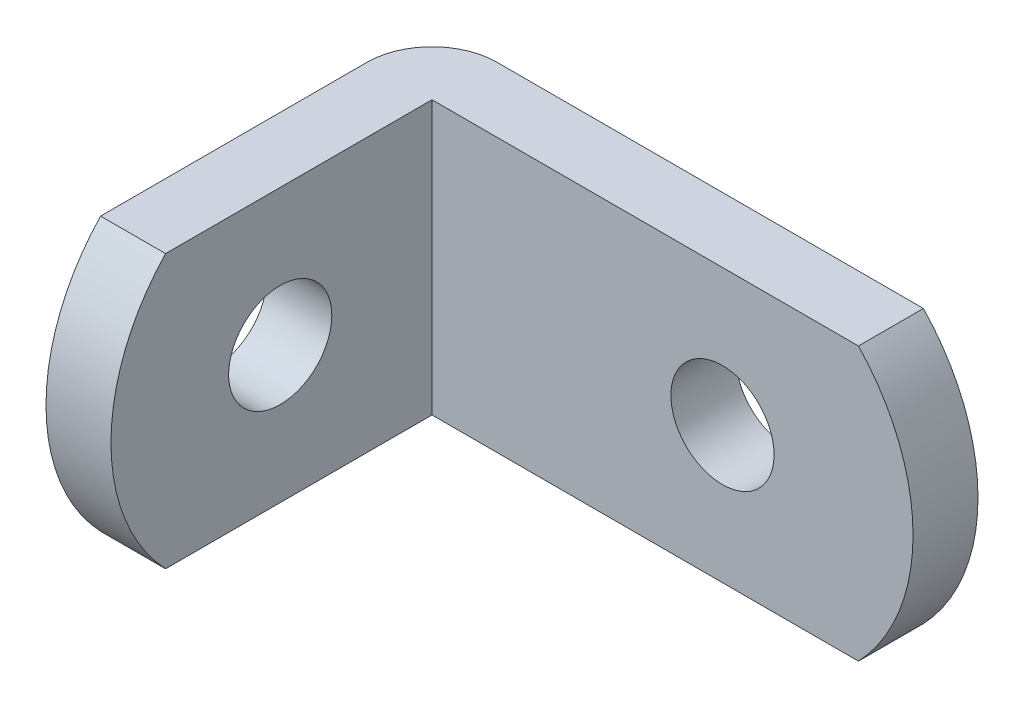
ISO-10303-21;
HEADER;
FILE_DESCRIPTION(('STEP AP214'),'2;1');
FILE_NAME('part.step','',(''),(''),'','','');
FILE_SCHEMA(('AUTOMOTIVE_DESIGN { 1 0 10303 214 1 1 1 1 }'));
ENDSEC;
DATA;
#1=APPLICATION_CONTEXT('core data for automotive mechanical design processes');
#2=APPLICATION_PROTOCOL_DEFINITION('international standard','automotive_design',2000,#1);
#3=PRODUCT_CONTEXT('',#1,'mechanical');
#4=PRODUCT('Part','Part','',(#3));
#5=PRODUCT_RELATED_PRODUCT_CATEGORY('part','',(#4));
#6=PRODUCT_DEFINITION_FORMATION('','',#4);
#7=PRODUCT_DEFINITION_CONTEXT('part definition',#1,'design');
#8=PRODUCT_DEFINITION('design','',#6,#7);
#9=PRODUCT_DEFINITION_SHAPE('','',#8);
#10=(LENGTH_UNIT() NAMED_UNIT(*) SI_UNIT(.MILLI.,.METRE.));
#11=(NAMED_UNIT(*) PLANE_ANGLE_UNIT() SI_UNIT($,.RADIAN.));
#12=(NAMED_UNIT(*) SI_UNIT($,.STERADIAN.) SOLID_ANGLE_UNIT());
#13=UNCERTAINTY_MEASURE_WITH_UNIT(LENGTH_MEASURE(1.E-05),#10,'distance_accuracy_value','');
#14=(GEOMETRIC_REPRESENTATION_CONTEXT(3) GLOBAL_UNCERTAINTY_ASSIGNED_CONTEXT((#13)) GLOBAL_UNIT_ASSIGNED_CONTEXT((#10,
#11,#12)) REPRESENTATION_CONTEXT('',''));
#15=CARTESIAN_POINT('',(0.,0.,0.));
#16=DIRECTION('',(0.,0.,1.));
#17=DIRECTION('',(1.,0.,0.));
#18=AXIS2_PLACEMENT_3D('',#15,#16,#17);
#19=CARTESIAN_POINT('',(72.9938399678853,0.,8.75030000000001));
#20=DIRECTION('',(-1.,0.,0.));
#21=DIRECTION('',(0.,0.,1.));
#22=AXIS2_PLACEMENT_3D('',#19,#20,#21);
#23=CYLINDRICAL_SURFACE('',#22,9.20749999999999);
#24=DIRECTION('',(-1.,0.,0.));
#25=VECTOR('',#24,1.);
#26=CARTESIAN_POINT('',(72.9938399678853,-6.35,15.4178));
#27=LINE('',#26,#25);
#28=CARTESIAN_POINT('',(0.,-6.35,15.4178));
#29=VERTEX_POINT('',#28);
#30=CARTESIAN_POINT('',(3.0226,-6.34999999999999,15.4178));
#31=VERTEX_POINT('',#30);
#32=EDGE_CURVE('E42',#29,#31,#27,.F.);
#33=ORIENTED_EDGE('',*,*,#32,.T.);
#34=CARTESIAN_POINT('',(3.0226,0.,8.75030000000001));
#35=DIRECTION('',(-1.,0.,0.));
#36=DIRECTION('',(0.,0.,1.));
#37=AXIS2_PLACEMENT_3D('',#34,#35,#36);
#38=CIRCLE('',#37,9.20749999999999);
#39=CARTESIAN_POINT('',(3.0226,6.35,15.4178));
#40=VERTEX_POINT('',#39);
#41=EDGE_CURVE('E123',#40,#31,#38,.F.);
#42=ORIENTED_EDGE('',*,*,#41,.F.);
#43=DIRECTION('',(-1.,0.,0.));
#44=VECTOR('',#43,1.);
#45=CARTESIAN_POINT('',(72.9938399678853,6.35,15.4178));
#46=LINE('',#45,#44);
#47=CARTESIAN_POINT('',(0.,6.35,15.4178));
#48=VERTEX_POINT('',#47);
#49=EDGE_CURVE('E119',#40,#48,#46,.T.);
#50=ORIENTED_EDGE('',*,*,#49,.T.);
#51=CARTESIAN_POINT('',(0.,0.,8.75030000000001));
#52=DIRECTION('',(-1.,0.,0.));
#53=DIRECTION('',(0.,0.,1.));
#54=AXIS2_PLACEMENT_3D('',#51,#52,#53);
#55=CIRCLE('',#54,9.20749999999999);
#56=EDGE_CURVE('E125',#48,#29,#55,.F.);
#57=ORIENTED_EDGE('',*,*,#56,.T.);
#58=EDGE_LOOP('',(#33,#42,#50,#57));
#59=FACE_BOUND('',#58,.T.);
#60=ADVANCED_FACE('F34',(#59),#23,.T.);
#61=CARTESIAN_POINT('',(3.0226,6.35,3.0226));
#62=DIRECTION('',(0.,0.,-1.));
#63=DIRECTION('',(-1.,0.,0.));
#64=AXIS2_PLACEMENT_3D('',#61,#62,#63);
#65=PLANE('',#64);
#66=CARTESIAN_POINT('',(16.5354,0.,3.0226));
#67=DIRECTION('',(0.,0.,1.));
#68=DIRECTION('',(1.,0.,0.));
#69=AXIS2_PLACEMENT_3D('',#66,#67,#68);
#70=CIRCLE('',#69,2.4);
#71=CARTESIAN_POINT('',(18.9354,0.,3.0226));
#72=VERTEX_POINT('',#71);
#73=EDGE_CURVE('E167',#72,#72,#70,.T.);
#74=ORIENTED_EDGE('',*,*,#73,.F.);
#75=EDGE_LOOP('',(#74));
#76=FACE_BOUND('',#75,.T.);
#77=DIRECTION('',(1.,0.,0.));
#78=VECTOR('',#77,1.);
#79=CARTESIAN_POINT('',(3.0226,-6.35,3.0226));
#80=LINE('',#79,#78);
#81=CARTESIAN_POINT('',(3.0226,-6.35,3.0226));
#82=VERTEX_POINT('',#81);
#83=CARTESIAN_POINT('',(22.86,-6.35,3.0226));
#84=VERTEX_POINT('',#83);
#85=EDGE_CURVE('E102',#82,#84,#80,.T.);
#86=ORIENTED_EDGE('',*,*,#85,.T.);
#87=CARTESIAN_POINT('',(16.1925,0.,3.0226));
#88=DIRECTION('',(0.,0.,-1.));
#89=DIRECTION('',(-1.,0.,0.));
#90=AXIS2_PLACEMENT_3D('',#87,#88,#89);
#91=CIRCLE('',#90,9.20749999999998);
#92=CARTESIAN_POINT('',(22.86,6.35,3.0226));
#93=VERTEX_POINT('',#92);
#94=EDGE_CURVE('E56',#84,#93,#91,.F.);
#95=ORIENTED_EDGE('',*,*,#94,.T.);
#96=DIRECTION('',(1.,0.,0.));
#97=VECTOR('',#96,1.);
#98=CARTESIAN_POINT('',(3.0226,6.35,3.0226));
#99=LINE('',#98,#97);
#100=CARTESIAN_POINT('',(3.0226,6.35,3.0226));
#101=VERTEX_POINT('',#100);
#102=EDGE_CURVE('E128',#101,#93,#99,.T.);
#103=ORIENTED_EDGE('',*,*,#102,.F.);
#104=DIRECTION('',(0.,-1.,0.));
#105=VECTOR('',#104,1.);
#106=CARTESIAN_POINT('',(3.0226,6.35,3.0226));
#107=LINE('',#106,#105);
#108=EDGE_CURVE('E139',#101,#82,#107,.T.);
#109=ORIENTED_EDGE('',*,*,#108,.T.);
#110=EDGE_LOOP('',(#86,#95,#103,#109));
#111=FACE_BOUND('',#110,.T.);
#112=ADVANCED_FACE('F36',(#76,#111),#65,.F.);
#113=CARTESIAN_POINT('',(3.0226,6.35,0.));
#114=DIRECTION('',(0.,0.,-1.));
#115=DIRECTION('',(-1.,0.,0.));
#116=AXIS2_PLACEMENT_3D('',#113,#114,#115);
#117=PLANE('',#116);
#118=CARTESIAN_POINT('',(16.5354,0.,0.));
#119=DIRECTION('',(0.,0.,1.));
#120=DIRECTION('',(1.,0.,0.));
#121=AXIS2_PLACEMENT_3D('',#118,#119,#120);
#122=CIRCLE('',#121,2.4);
#123=CARTESIAN_POINT('',(18.9354,0.,0.));
#124=VERTEX_POINT('',#123);
#125=EDGE_CURVE('E165',#124,#124,#122,.T.);
#126=ORIENTED_EDGE('',*,*,#125,.T.);
#127=EDGE_LOOP('',(#126));
#128=FACE_BOUND('',#127,.T.);
#129=CARTESIAN_POINT('',(16.1925,0.,0.));
#130=DIRECTION('',(0.,0.,-1.));
#131=DIRECTION('',(-1.,0.,0.));
#132=AXIS2_PLACEMENT_3D('',#129,#130,#131);
#133=CIRCLE('',#132,9.20749999999998);
#134=CARTESIAN_POINT('',(22.86,-6.35,0.));
#135=VERTEX_POINT('',#134);
#136=CARTESIAN_POINT('',(22.86,6.35,0.));
#137=VERTEX_POINT('',#136);
#138=EDGE_CURVE('E48',#135,#137,#133,.F.);
#139=ORIENTED_EDGE('',*,*,#138,.F.);
#140=DIRECTION('',(1.,0.,0.));
#141=VECTOR('',#140,1.);
#142=CARTESIAN_POINT('',(3.0226,-6.35,0.));
#143=LINE('',#142,#141);
#144=CARTESIAN_POINT('',(3.0226,-6.35,0.));
#145=VERTEX_POINT('',#144);
#146=EDGE_CURVE('E96',#145,#135,#143,.T.);
#147=ORIENTED_EDGE('',*,*,#146,.F.);
#148=DIRECTION('',(0.,-1.,0.));
#149=VECTOR('',#148,1.);
#150=CARTESIAN_POINT('',(3.0226,6.35,0.));
#151=LINE('',#150,#149);
#152=CARTESIAN_POINT('',(3.0226,6.35,0.));
#153=VERTEX_POINT('',#152);
#154=EDGE_CURVE('E150',#153,#145,#151,.T.);
#155=ORIENTED_EDGE('',*,*,#154,.F.);
#156=DIRECTION('',(1.,0.,0.));
#157=VECTOR('',#156,1.);
#158=CARTESIAN_POINT('',(3.0226,6.35,0.));
#159=LINE('',#158,#157);
#160=EDGE_CURVE('E107',#153,#137,#159,.T.);
#161=ORIENTED_EDGE('',*,*,#160,.T.);
#162=EDGE_LOOP('',(#139,#147,#155,#161));
#163=FACE_BOUND('',#162,.T.);
#164=ADVANCED_FACE('F105',(#128,#163),#117,.T.);
#165=CARTESIAN_POINT('',(3.0226,6.35,3.0226));
#166=DIRECTION('',(0.,-1.,0.));
#167=DIRECTION('',(0.,0.,-1.));
#168=AXIS2_PLACEMENT_3D('',#165,#166,#167);
#169=CYLINDRICAL_SURFACE('',#168,3.0226);
#170=CARTESIAN_POINT('',(3.0226,-6.35,3.0226));
#171=DIRECTION('',(0.,-1.,0.));
#172=DIRECTION('',(0.,0.,1.));
#173=AXIS2_PLACEMENT_3D('',#170,#171,#172);
#174=CIRCLE('',#173,3.0226);
#175=CARTESIAN_POINT('',(0.,-6.35,3.0226));
#176=VERTEX_POINT('',#175);
#177=EDGE_CURVE('E100',#176,#145,#174,.T.);
#178=ORIENTED_EDGE('',*,*,#177,.F.);
#179=DIRECTION('',(0.,-1.,0.));
#180=VECTOR('',#179,1.);
#181=CARTESIAN_POINT('',(0.,6.35,3.0226));
#182=LINE('',#181,#180);
#183=CARTESIAN_POINT('',(0.,6.35,3.0226));
#184=VERTEX_POINT('',#183);
#185=EDGE_CURVE('E147',#184,#176,#182,.T.);
#186=ORIENTED_EDGE('',*,*,#185,.F.);
#187=CARTESIAN_POINT('',(3.0226,6.35,3.0226));
#188=DIRECTION('',(0.,-1.,0.));
#189=DIRECTION('',(0.,0.,1.));
#190=AXIS2_PLACEMENT_3D('',#187,#188,#189);
#191=CIRCLE('',#190,3.0226);
#192=EDGE_CURVE('E132',#184,#153,#191,.T.);
#193=ORIENTED_EDGE('',*,*,#192,.T.);
#194=ORIENTED_EDGE('',*,*,#154,.T.);
#195=EDGE_LOOP('',(#178,#186,#193,#194));
#196=FACE_BOUND('',#195,.T.);
#197=ADVANCED_FACE('F162',(#196),#169,.T.);
#198=CARTESIAN_POINT('',(0.,6.35,3.0226));
#199=DIRECTION('',(-1.,0.,0.));
#200=DIRECTION('',(0.,0.,1.));
#201=AXIS2_PLACEMENT_3D('',#198,#199,#200);
#202=PLANE('',#201);
#203=CARTESIAN_POINT('',(0.,0.,10.0838));
#204=DIRECTION('',(1.,0.,0.));
#205=DIRECTION('',(0.,0.,-1.));
#206=AXIS2_PLACEMENT_3D('',#203,#204,#205);
#207=CIRCLE('',#206,2.4);
#208=CARTESIAN_POINT('',(0.,0.,7.6838));
#209=VERTEX_POINT('',#208);
#210=EDGE_CURVE('E114',#209,#209,#207,.T.);
#211=ORIENTED_EDGE('',*,*,#210,.T.);
#212=EDGE_LOOP('',(#211));
#213=FACE_BOUND('',#212,.T.);
#214=ORIENTED_EDGE('',*,*,#56,.F.);
#215=DIRECTION('',(0.,0.,-1.));
#216=VECTOR('',#215,1.);
#217=CARTESIAN_POINT('',(0.,6.35,3.0226));
#218=LINE('',#217,#216);
#219=EDGE_CURVE('E135',#48,#184,#218,.T.);
#220=ORIENTED_EDGE('',*,*,#219,.T.);
#221=ORIENTED_EDGE('',*,*,#185,.T.);
#222=DIRECTION('',(0.,0.,-1.));
#223=VECTOR('',#222,1.);
#224=CARTESIAN_POINT('',(0.,-6.35,3.0226));
#225=LINE('',#224,#223);
#226=EDGE_CURVE('E142',#29,#176,#225,.T.);
#227=ORIENTED_EDGE('',*,*,#226,.F.);
#228=EDGE_LOOP('',(#214,#220,#221,#227));
#229=FACE_BOUND('',#228,.T.);
#230=ADVANCED_FACE('F157',(#213,#229),#202,.T.);
#231=CARTESIAN_POINT('',(3.0226,6.35,3.0226));
#232=DIRECTION('',(-1.,0.,0.));
#233=DIRECTION('',(0.,0.,1.));
#234=AXIS2_PLACEMENT_3D('',#231,#232,#233);
#235=PLANE('',#234);
#236=CARTESIAN_POINT('',(3.0226,0.,10.0838));
#237=DIRECTION('',(1.,0.,0.));
#238=DIRECTION('',(0.,0.,-1.));
#239=AXIS2_PLACEMENT_3D('',#236,#237,#238);
#240=CIRCLE('',#239,2.4);
#241=CARTESIAN_POINT('',(3.0226,0.,7.6838));
#242=VERTEX_POINT('',#241);
#243=EDGE_CURVE('E111',#242,#242,#240,.T.);
#244=ORIENTED_EDGE('',*,*,#243,.F.);
#245=EDGE_LOOP('',(#244));
#246=FACE_BOUND('',#245,.T.);
#247=ORIENTED_EDGE('',*,*,#41,.T.);
#248=DIRECTION('',(0.,0.,-1.));
#249=VECTOR('',#248,1.);
#250=CARTESIAN_POINT('',(3.0226,-6.35,3.0226));
#251=LINE('',#250,#249);
#252=EDGE_CURVE('E130',#31,#82,#251,.T.);
#253=ORIENTED_EDGE('',*,*,#252,.T.);
#254=ORIENTED_EDGE('',*,*,#108,.F.);
#255=DIRECTION('',(0.,0.,-1.));
#256=VECTOR('',#255,1.);
#257=CARTESIAN_POINT('',(3.0226,6.35,3.0226));
#258=LINE('',#257,#256);
#259=EDGE_CURVE('E137',#40,#101,#258,.T.);
#260=ORIENTED_EDGE('',*,*,#259,.F.);
#261=EDGE_LOOP('',(#247,#253,#254,#260));
#262=FACE_BOUND('',#261,.T.);
#263=ADVANCED_FACE('F179',(#246,#262),#235,.F.);
#264=CARTESIAN_POINT('',(3.0226,6.35,3.0226));
#265=DIRECTION('',(0.,-1.,0.));
#266=DIRECTION('',(-1.,0.,0.));
#267=AXIS2_PLACEMENT_3D('',#264,#265,#266);
#268=PLANE('',#267);
#269=ORIENTED_EDGE('',*,*,#102,.T.);
#270=DIRECTION('',(0.,0.,-1.));
#271=VECTOR('',#270,1.);
#272=CARTESIAN_POINT('',(22.86,6.35,60.5160899678853));
#273=LINE('',#272,#271);
#274=EDGE_CURVE('E108',#93,#137,#273,.T.);
#275=ORIENTED_EDGE('',*,*,#274,.T.);
#276=ORIENTED_EDGE('',*,*,#160,.F.);
#277=ORIENTED_EDGE('',*,*,#192,.F.);
#278=ORIENTED_EDGE('',*,*,#219,.F.);
#279=ORIENTED_EDGE('',*,*,#49,.F.);
#280=ORIENTED_EDGE('',*,*,#259,.T.);
#281=EDGE_LOOP('',(#269,#275,#276,#277,#278,#279,#280));
#282=FACE_BOUND('',#281,.T.);
#283=ADVANCED_FACE('F164',(#282),#268,.F.);
#284=CARTESIAN_POINT('',(3.0226,-6.35,3.0226));
#285=DIRECTION('',(0.,-1.,0.));
#286=DIRECTION('',(-1.,0.,0.));
#287=AXIS2_PLACEMENT_3D('',#284,#285,#286);
#288=PLANE('',#287);
#289=DIRECTION('',(0.,0.,-1.));
#290=VECTOR('',#289,1.);
#291=CARTESIAN_POINT('',(22.86,-6.35,60.5160899678853));
#292=LINE('',#291,#290);
#293=EDGE_CURVE('E11',#84,#135,#292,.T.);
#294=ORIENTED_EDGE('',*,*,#293,.F.);
#295=ORIENTED_EDGE('',*,*,#85,.F.);
#296=ORIENTED_EDGE('',*,*,#252,.F.);
#297=ORIENTED_EDGE('',*,*,#32,.F.);
#298=ORIENTED_EDGE('',*,*,#226,.T.);
#299=ORIENTED_EDGE('',*,*,#177,.T.);
#300=ORIENTED_EDGE('',*,*,#146,.T.);
#301=EDGE_LOOP('',(#294,#295,#296,#297,#298,#299,#300));
#302=FACE_BOUND('',#301,.T.);
#303=ADVANCED_FACE('F97',(#302),#288,.T.);
#304=CARTESIAN_POINT('',(0.,0.,10.0838));
#305=DIRECTION('',(1.,0.,0.));
#306=DIRECTION('',(0.,0.,-1.));
#307=AXIS2_PLACEMENT_3D('',#304,#305,#306);
#308=CYLINDRICAL_SURFACE('',#307,2.4);
#309=ORIENTED_EDGE('',*,*,#210,.F.);
#310=EDGE_LOOP('',(#309));
#311=FACE_BOUND('',#310,.T.);
#312=ORIENTED_EDGE('',*,*,#243,.T.);
#313=EDGE_LOOP('',(#312));
#314=FACE_BOUND('',#313,.T.);
#315=ADVANCED_FACE('F197',(#311,#314),#308,.F.);
#316=CARTESIAN_POINT('',(16.1925,0.,60.5160899678853));
#317=DIRECTION('',(0.,0.,-1.));
#318=DIRECTION('',(-1.,0.,0.));
#319=AXIS2_PLACEMENT_3D('',#316,#317,#318);
#320=CYLINDRICAL_SURFACE('',#319,9.20749999999998);
#321=ORIENTED_EDGE('',*,*,#94,.F.);
#322=ORIENTED_EDGE('',*,*,#293,.T.);
#323=ORIENTED_EDGE('',*,*,#138,.T.);
#324=ORIENTED_EDGE('',*,*,#274,.F.);
#325=EDGE_LOOP('',(#321,#322,#323,#324));
#326=FACE_BOUND('',#325,.T.);
#327=ADVANCED_FACE('F110',(#326),#320,.T.);
#328=CARTESIAN_POINT('',(16.5354,0.,0.));
#329=DIRECTION('',(0.,0.,1.));
#330=DIRECTION('',(1.,0.,0.));
#331=AXIS2_PLACEMENT_3D('',#328,#329,#330);
#332=CYLINDRICAL_SURFACE('',#331,2.4);
#333=ORIENTED_EDGE('',*,*,#125,.F.);
#334=EDGE_LOOP('',(#333));
#335=FACE_BOUND('',#334,.T.);
#336=ORIENTED_EDGE('',*,*,#73,.T.);
#337=EDGE_LOOP('',(#336));
#338=FACE_BOUND('',#337,.T.);
#339=ADVANCED_FACE('F173',(#335,#338),#332,.F.);
#340=CLOSED_SHELL('',(#60,#112,#164,#197,#230,#263,#283,#303,#315,#327,#339));
#341=MANIFOLD_SOLID_BREP('B2',#340);
#342=ADVANCED_BREP_SHAPE_REPRESENTATION('',(#18,#341),#14);
#343=SHAPE_DEFINITION_REPRESENTATION(#9,#342);
ENDSEC;
END-ISO-10303-21;
